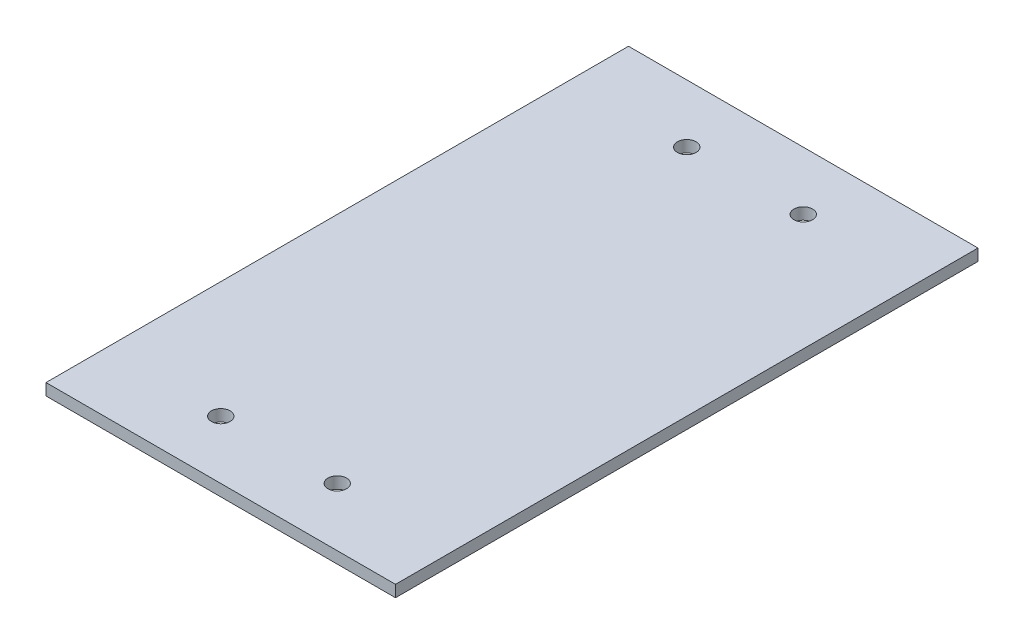
ISO-10303-21;
HEADER;
FILE_DESCRIPTION(('STEP AP214'),'2;1');
FILE_NAME('part.step','',(''),(''),'','','');
FILE_SCHEMA(('AUTOMOTIVE_DESIGN { 1 0 10303 214 1 1 1 1 }'));
ENDSEC;
DATA;
#1=APPLICATION_CONTEXT('core data for automotive mechanical design processes');
#2=APPLICATION_PROTOCOL_DEFINITION('international standard','automotive_design',2000,#1);
#3=PRODUCT_CONTEXT('',#1,'mechanical');
#4=PRODUCT('Part','Part','',(#3));
#5=PRODUCT_RELATED_PRODUCT_CATEGORY('part','',(#4));
#6=PRODUCT_DEFINITION_FORMATION('','',#4);
#7=PRODUCT_DEFINITION_CONTEXT('part definition',#1,'design');
#8=PRODUCT_DEFINITION('design','',#6,#7);
#9=PRODUCT_DEFINITION_SHAPE('','',#8);
#10=(LENGTH_UNIT() NAMED_UNIT(*) SI_UNIT(.MILLI.,.METRE.));
#11=(NAMED_UNIT(*) PLANE_ANGLE_UNIT() SI_UNIT($,.RADIAN.));
#12=(NAMED_UNIT(*) SI_UNIT($,.STERADIAN.) SOLID_ANGLE_UNIT());
#13=UNCERTAINTY_MEASURE_WITH_UNIT(LENGTH_MEASURE(1.E-05),#10,'distance_accuracy_value','');
#14=(GEOMETRIC_REPRESENTATION_CONTEXT(3) GLOBAL_UNCERTAINTY_ASSIGNED_CONTEXT((#13)) GLOBAL_UNIT_ASSIGNED_CONTEXT((#10,
#11,#12)) REPRESENTATION_CONTEXT('',''));
#15=CARTESIAN_POINT('',(0.,0.,0.));
#16=DIRECTION('',(0.,0.,1.));
#17=DIRECTION('',(1.,0.,0.));
#18=AXIS2_PLACEMENT_3D('',#15,#16,#17);
#19=CARTESIAN_POINT('',(30.,2.,50.));
#20=DIRECTION('',(-1.,0.,0.));
#21=DIRECTION('',(0.,0.,1.));
#22=AXIS2_PLACEMENT_3D('',#19,#20,#21);
#23=PLANE('',#22);
#24=DIRECTION('',(0.,0.,-1.));
#25=VECTOR('',#24,1.);
#26=CARTESIAN_POINT('',(30.,0.,50.));
#27=LINE('',#26,#25);
#28=CARTESIAN_POINT('',(30.,0.,50.));
#29=VERTEX_POINT('',#28);
#30=CARTESIAN_POINT('',(30.,0.,-50.));
#31=VERTEX_POINT('',#30);
#32=EDGE_CURVE('E97',#29,#31,#27,.T.);
#33=ORIENTED_EDGE('',*,*,#32,.T.);
#34=DIRECTION('',(0.,-1.,0.));
#35=VECTOR('',#34,1.);
#36=CARTESIAN_POINT('',(30.,2.,-50.));
#37=LINE('',#36,#35);
#38=CARTESIAN_POINT('',(30.,2.,-50.));
#39=VERTEX_POINT('',#38);
#40=EDGE_CURVE('E11',#39,#31,#37,.T.);
#41=ORIENTED_EDGE('',*,*,#40,.F.);
#42=DIRECTION('',(0.,0.,-1.));
#43=VECTOR('',#42,1.);
#44=CARTESIAN_POINT('',(30.,2.,50.));
#45=LINE('',#44,#43);
#46=CARTESIAN_POINT('',(30.,2.,50.));
#47=VERTEX_POINT('',#46);
#48=EDGE_CURVE('E85',#47,#39,#45,.T.);
#49=ORIENTED_EDGE('',*,*,#48,.F.);
#50=DIRECTION('',(0.,-1.,0.));
#51=VECTOR('',#50,1.);
#52=CARTESIAN_POINT('',(30.,2.,50.));
#53=LINE('',#52,#51);
#54=EDGE_CURVE('E93',#47,#29,#53,.T.);
#55=ORIENTED_EDGE('',*,*,#54,.T.);
#56=EDGE_LOOP('',(#33,#41,#49,#55));
#57=FACE_BOUND('',#56,.T.);
#58=ADVANCED_FACE('F34',(#57),#23,.F.);
#59=CARTESIAN_POINT('',(-30.,2.,-50.));
#60=DIRECTION('',(0.,0.,1.));
#61=DIRECTION('',(1.,0.,0.));
#62=AXIS2_PLACEMENT_3D('',#59,#60,#61);
#63=PLANE('',#62);
#64=DIRECTION('',(-1.,0.,0.));
#65=VECTOR('',#64,1.);
#66=CARTESIAN_POINT('',(-30.,0.,-50.));
#67=LINE('',#66,#65);
#68=CARTESIAN_POINT('',(-30.,0.,-50.));
#69=VERTEX_POINT('',#68);
#70=EDGE_CURVE('E89',#31,#69,#67,.T.);
#71=ORIENTED_EDGE('',*,*,#70,.T.);
#72=DIRECTION('',(0.,-1.,0.));
#73=VECTOR('',#72,1.);
#74=CARTESIAN_POINT('',(-30.,2.,-50.));
#75=LINE('',#74,#73);
#76=CARTESIAN_POINT('',(-30.,2.,-50.));
#77=VERTEX_POINT('',#76);
#78=EDGE_CURVE('E42',#77,#69,#75,.T.);
#79=ORIENTED_EDGE('',*,*,#78,.F.);
#80=DIRECTION('',(-1.,0.,0.));
#81=VECTOR('',#80,1.);
#82=CARTESIAN_POINT('',(-30.,2.,-50.));
#83=LINE('',#82,#81);
#84=EDGE_CURVE('E80',#39,#77,#83,.T.);
#85=ORIENTED_EDGE('',*,*,#84,.F.);
#86=ORIENTED_EDGE('',*,*,#40,.T.);
#87=EDGE_LOOP('',(#71,#79,#85,#86));
#88=FACE_BOUND('',#87,.T.);
#89=ADVANCED_FACE('F88',(#88),#63,.F.);
#90=CARTESIAN_POINT('',(-30.,2.,50.));
#91=DIRECTION('',(1.,0.,0.));
#92=DIRECTION('',(0.,0.,-1.));
#93=AXIS2_PLACEMENT_3D('',#90,#91,#92);
#94=PLANE('',#93);
#95=DIRECTION('',(0.,0.,1.));
#96=VECTOR('',#95,1.);
#97=CARTESIAN_POINT('',(-30.,0.,50.));
#98=LINE('',#97,#96);
#99=CARTESIAN_POINT('',(-30.,0.,50.));
#100=VERTEX_POINT('',#99);
#101=EDGE_CURVE('E67',#69,#100,#98,.T.);
#102=ORIENTED_EDGE('',*,*,#101,.T.);
#103=DIRECTION('',(0.,-1.,0.));
#104=VECTOR('',#103,1.);
#105=CARTESIAN_POINT('',(-30.,2.,50.));
#106=LINE('',#105,#104);
#107=CARTESIAN_POINT('',(-30.,2.,50.));
#108=VERTEX_POINT('',#107);
#109=EDGE_CURVE('E90',#108,#100,#106,.T.);
#110=ORIENTED_EDGE('',*,*,#109,.F.);
#111=DIRECTION('',(0.,0.,1.));
#112=VECTOR('',#111,1.);
#113=CARTESIAN_POINT('',(-30.,2.,50.));
#114=LINE('',#113,#112);
#115=EDGE_CURVE('E83',#77,#108,#114,.T.);
#116=ORIENTED_EDGE('',*,*,#115,.F.);
#117=ORIENTED_EDGE('',*,*,#78,.T.);
#118=EDGE_LOOP('',(#102,#110,#116,#117));
#119=FACE_BOUND('',#118,.T.);
#120=ADVANCED_FACE('F91',(#119),#94,.F.);
#121=CARTESIAN_POINT('',(-30.,2.,50.));
#122=DIRECTION('',(0.,0.,-1.));
#123=DIRECTION('',(-1.,0.,0.));
#124=AXIS2_PLACEMENT_3D('',#121,#122,#123);
#125=PLANE('',#124);
#126=DIRECTION('',(1.,0.,0.));
#127=VECTOR('',#126,1.);
#128=CARTESIAN_POINT('',(-30.,0.,50.));
#129=LINE('',#128,#127);
#130=EDGE_CURVE('E73',#100,#29,#129,.T.);
#131=ORIENTED_EDGE('',*,*,#130,.T.);
#132=ORIENTED_EDGE('',*,*,#54,.F.);
#133=DIRECTION('',(1.,0.,0.));
#134=VECTOR('',#133,1.);
#135=CARTESIAN_POINT('',(-30.,2.,50.));
#136=LINE('',#135,#134);
#137=EDGE_CURVE('E50',#108,#47,#136,.T.);
#138=ORIENTED_EDGE('',*,*,#137,.F.);
#139=ORIENTED_EDGE('',*,*,#109,.T.);
#140=EDGE_LOOP('',(#131,#132,#138,#139));
#141=FACE_BOUND('',#140,.T.);
#142=ADVANCED_FACE('F105',(#141),#125,.F.);
#143=CARTESIAN_POINT('',(0.,2.,0.));
#144=DIRECTION('',(0.,-1.,0.));
#145=DIRECTION('',(0.,0.,-1.));
#146=AXIS2_PLACEMENT_3D('',#143,#144,#145);
#147=PLANE('',#146);
#148=CARTESIAN_POINT('',(10.,2.,-40.));
#149=DIRECTION('',(0.,1.,0.));
#150=DIRECTION('',(0.,0.,-1.));
#151=AXIS2_PLACEMENT_3D('',#148,#149,#150);
#152=CIRCLE('',#151,1.60000000000001);
#153=CARTESIAN_POINT('',(10.,2.,-41.6));
#154=VERTEX_POINT('',#153);
#155=EDGE_CURVE('E120',#154,#154,#152,.T.);
#156=ORIENTED_EDGE('',*,*,#155,.F.);
#157=EDGE_LOOP('',(#156));
#158=FACE_BOUND('',#157,.T.);
#159=CARTESIAN_POINT('',(10.,2.,40.));
#160=DIRECTION('',(0.,1.,0.));
#161=DIRECTION('',(0.,0.,1.));
#162=AXIS2_PLACEMENT_3D('',#159,#160,#161);
#163=CIRCLE('',#162,1.6);
#164=CARTESIAN_POINT('',(10.,2.,41.6));
#165=VERTEX_POINT('',#164);
#166=EDGE_CURVE('E126',#165,#165,#163,.T.);
#167=ORIENTED_EDGE('',*,*,#166,.F.);
#168=EDGE_LOOP('',(#167));
#169=FACE_BOUND('',#168,.T.);
#170=CARTESIAN_POINT('',(-10.,2.,40.));
#171=DIRECTION('',(0.,1.,0.));
#172=DIRECTION('',(0.,0.,-1.));
#173=AXIS2_PLACEMENT_3D('',#170,#171,#172);
#174=CIRCLE('',#173,1.6);
#175=CARTESIAN_POINT('',(-10.,2.,38.4));
#176=VERTEX_POINT('',#175);
#177=EDGE_CURVE('E114',#176,#176,#174,.T.);
#178=ORIENTED_EDGE('',*,*,#177,.F.);
#179=EDGE_LOOP('',(#178));
#180=FACE_BOUND('',#179,.T.);
#181=CARTESIAN_POINT('',(-10.,2.,-40.));
#182=DIRECTION('',(0.,1.,0.));
#183=DIRECTION('',(0.,0.,1.));
#184=AXIS2_PLACEMENT_3D('',#181,#182,#183);
#185=CIRCLE('',#184,1.6);
#186=CARTESIAN_POINT('',(-10.,2.,-38.4));
#187=VERTEX_POINT('',#186);
#188=EDGE_CURVE('E100',#187,#187,#185,.T.);
#189=ORIENTED_EDGE('',*,*,#188,.F.);
#190=EDGE_LOOP('',(#189));
#191=FACE_BOUND('',#190,.T.);
#192=ORIENTED_EDGE('',*,*,#48,.T.);
#193=ORIENTED_EDGE('',*,*,#84,.T.);
#194=ORIENTED_EDGE('',*,*,#115,.T.);
#195=ORIENTED_EDGE('',*,*,#137,.T.);
#196=EDGE_LOOP('',(#192,#193,#194,#195));
#197=FACE_BOUND('',#196,.T.);
#198=ADVANCED_FACE('F81',(#158,#169,#180,#191,#197),#147,.F.);
#199=CARTESIAN_POINT('',(0.,0.,0.));
#200=DIRECTION('',(0.,-1.,0.));
#201=DIRECTION('',(0.,0.,-1.));
#202=AXIS2_PLACEMENT_3D('',#199,#200,#201);
#203=PLANE('',#202);
#204=CARTESIAN_POINT('',(10.,0.,-40.));
#205=DIRECTION('',(0.,-1.,0.));
#206=DIRECTION('',(0.,0.,-1.));
#207=AXIS2_PLACEMENT_3D('',#204,#205,#206);
#208=CIRCLE('',#207,1.60000000000001);
#209=CARTESIAN_POINT('',(10.,0.,-41.6));
#210=VERTEX_POINT('',#209);
#211=EDGE_CURVE('E117',#210,#210,#208,.F.);
#212=ORIENTED_EDGE('',*,*,#211,.T.);
#213=EDGE_LOOP('',(#212));
#214=FACE_BOUND('',#213,.T.);
#215=CARTESIAN_POINT('',(10.,0.,40.));
#216=DIRECTION('',(0.,-1.,0.));
#217=DIRECTION('',(0.,0.,-1.));
#218=AXIS2_PLACEMENT_3D('',#215,#216,#217);
#219=CIRCLE('',#218,1.6);
#220=CARTESIAN_POINT('',(10.,0.,38.4));
#221=VERTEX_POINT('',#220);
#222=EDGE_CURVE('E123',#221,#221,#219,.F.);
#223=ORIENTED_EDGE('',*,*,#222,.T.);
#224=EDGE_LOOP('',(#223));
#225=FACE_BOUND('',#224,.T.);
#226=CARTESIAN_POINT('',(-10.,0.,40.));
#227=DIRECTION('',(0.,-1.,0.));
#228=DIRECTION('',(0.,0.,-1.));
#229=AXIS2_PLACEMENT_3D('',#226,#227,#228);
#230=CIRCLE('',#229,1.6);
#231=CARTESIAN_POINT('',(-10.,0.,38.4));
#232=VERTEX_POINT('',#231);
#233=EDGE_CURVE('E129',#232,#232,#230,.F.);
#234=ORIENTED_EDGE('',*,*,#233,.T.);
#235=EDGE_LOOP('',(#234));
#236=FACE_BOUND('',#235,.T.);
#237=CARTESIAN_POINT('',(-10.,0.,-40.));
#238=DIRECTION('',(0.,-1.,0.));
#239=DIRECTION('',(0.,0.,-1.));
#240=AXIS2_PLACEMENT_3D('',#237,#238,#239);
#241=CIRCLE('',#240,1.6);
#242=CARTESIAN_POINT('',(-10.,0.,-41.6));
#243=VERTEX_POINT('',#242);
#244=EDGE_CURVE('E111',#243,#243,#241,.F.);
#245=ORIENTED_EDGE('',*,*,#244,.T.);
#246=EDGE_LOOP('',(#245));
#247=FACE_BOUND('',#246,.T.);
#248=ORIENTED_EDGE('',*,*,#32,.F.);
#249=ORIENTED_EDGE('',*,*,#130,.F.);
#250=ORIENTED_EDGE('',*,*,#101,.F.);
#251=ORIENTED_EDGE('',*,*,#70,.F.);
#252=EDGE_LOOP('',(#248,#249,#250,#251));
#253=FACE_BOUND('',#252,.T.);
#254=ADVANCED_FACE('F108',(#214,#225,#236,#247,#253),#203,.T.);
#255=CARTESIAN_POINT('',(-10.,-0.00100000000000013,-40.));
#256=DIRECTION('',(0.,1.,0.));
#257=DIRECTION('',(0.,0.,1.));
#258=AXIS2_PLACEMENT_3D('',#255,#256,#257);
#259=CYLINDRICAL_SURFACE('',#258,1.6);
#260=ORIENTED_EDGE('',*,*,#244,.F.);
#261=EDGE_LOOP('',(#260));
#262=FACE_BOUND('',#261,.T.);
#263=ORIENTED_EDGE('',*,*,#188,.T.);
#264=EDGE_LOOP('',(#263));
#265=FACE_BOUND('',#264,.T.);
#266=ADVANCED_FACE('F143',(#262,#265),#259,.F.);
#267=CARTESIAN_POINT('',(-10.,-0.00100000000000013,40.));
#268=DIRECTION('',(0.,1.,0.));
#269=DIRECTION('',(0.,0.,1.));
#270=AXIS2_PLACEMENT_3D('',#267,#268,#269);
#271=CYLINDRICAL_SURFACE('',#270,1.6);
#272=ORIENTED_EDGE('',*,*,#233,.F.);
#273=EDGE_LOOP('',(#272));
#274=FACE_BOUND('',#273,.T.);
#275=ORIENTED_EDGE('',*,*,#177,.T.);
#276=EDGE_LOOP('',(#275));
#277=FACE_BOUND('',#276,.T.);
#278=ADVANCED_FACE('F135',(#274,#277),#271,.F.);
#279=CARTESIAN_POINT('',(10.,-0.00100000000000013,40.));
#280=DIRECTION('',(0.,1.,0.));
#281=DIRECTION('',(0.,0.,1.));
#282=AXIS2_PLACEMENT_3D('',#279,#280,#281);
#283=CYLINDRICAL_SURFACE('',#282,1.6);
#284=ORIENTED_EDGE('',*,*,#222,.F.);
#285=EDGE_LOOP('',(#284));
#286=FACE_BOUND('',#285,.T.);
#287=ORIENTED_EDGE('',*,*,#166,.T.);
#288=EDGE_LOOP('',(#287));
#289=FACE_BOUND('',#288,.T.);
#290=ADVANCED_FACE('F151',(#286,#289),#283,.F.);
#291=CARTESIAN_POINT('',(10.,-0.00100000000000013,-40.));
#292=DIRECTION('',(0.,1.,0.));
#293=DIRECTION('',(0.,0.,1.));
#294=AXIS2_PLACEMENT_3D('',#291,#292,#293);
#295=CYLINDRICAL_SURFACE('',#294,1.60000000000001);
#296=ORIENTED_EDGE('',*,*,#211,.F.);
#297=EDGE_LOOP('',(#296));
#298=FACE_BOUND('',#297,.T.);
#299=ORIENTED_EDGE('',*,*,#155,.T.);
#300=EDGE_LOOP('',(#299));
#301=FACE_BOUND('',#300,.T.);
#302=ADVANCED_FACE('F199',(#298,#301),#295,.F.);
#303=CLOSED_SHELL('',(#58,#89,#120,#142,#198,#254,#266,#278,#290,#302));
#304=MANIFOLD_SOLID_BREP('B2',#303);
#305=ADVANCED_BREP_SHAPE_REPRESENTATION('',(#18,#304),#14);
#306=SHAPE_DEFINITION_REPRESENTATION(#9,#305);
ENDSEC;
END-ISO-10303-21;
